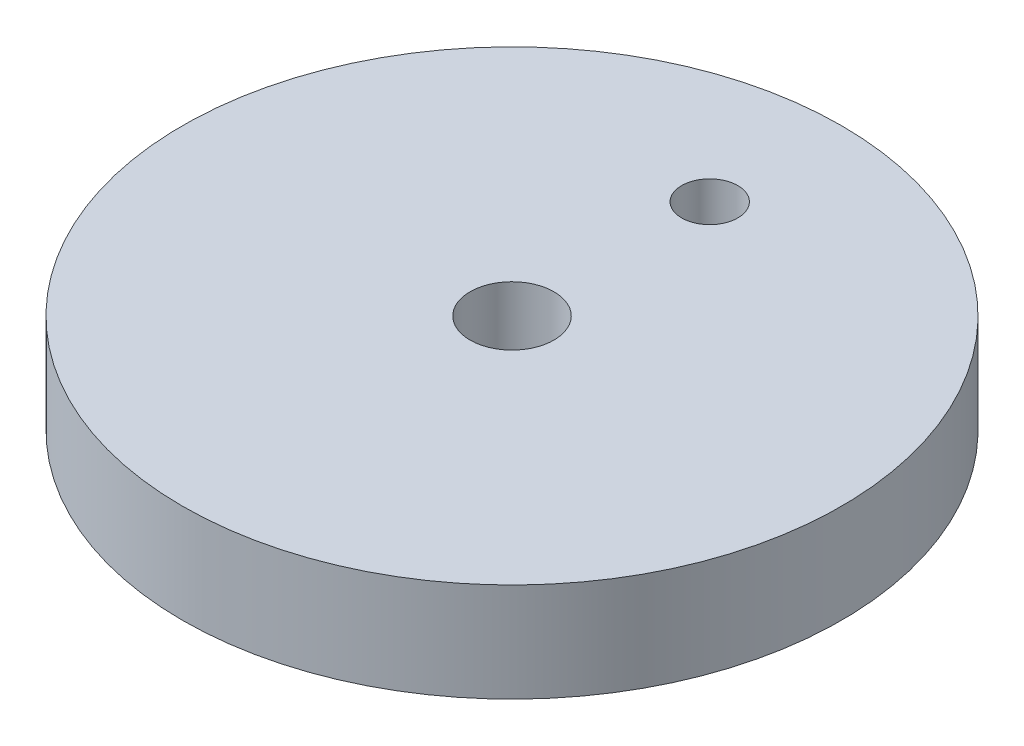
ISO-10303-21;
HEADER;
FILE_DESCRIPTION(('STEP AP214'),'2;1');
FILE_NAME('part.step','',(''),(''),'','','');
FILE_SCHEMA(('AUTOMOTIVE_DESIGN { 1 0 10303 214 1 1 1 1 }'));
ENDSEC;
DATA;
#1=APPLICATION_CONTEXT('core data for automotive mechanical design processes');
#2=APPLICATION_PROTOCOL_DEFINITION('international standard','automotive_design',2000,#1);
#3=PRODUCT_CONTEXT('',#1,'mechanical');
#4=PRODUCT('Part','Part','',(#3));
#5=PRODUCT_RELATED_PRODUCT_CATEGORY('part','',(#4));
#6=PRODUCT_DEFINITION_FORMATION('','',#4);
#7=PRODUCT_DEFINITION_CONTEXT('part definition',#1,'design');
#8=PRODUCT_DEFINITION('design','',#6,#7);
#9=PRODUCT_DEFINITION_SHAPE('','',#8);
#10=(LENGTH_UNIT() NAMED_UNIT(*) SI_UNIT(.MILLI.,.METRE.));
#11=(NAMED_UNIT(*) PLANE_ANGLE_UNIT() SI_UNIT($,.RADIAN.));
#12=(NAMED_UNIT(*) SI_UNIT($,.STERADIAN.) SOLID_ANGLE_UNIT());
#13=UNCERTAINTY_MEASURE_WITH_UNIT(LENGTH_MEASURE(1.E-05),#10,'distance_accuracy_value','');
#14=(GEOMETRIC_REPRESENTATION_CONTEXT(3) GLOBAL_UNCERTAINTY_ASSIGNED_CONTEXT((#13)) GLOBAL_UNIT_ASSIGNED_CONTEXT((#10,
#11,#12)) REPRESENTATION_CONTEXT('',''));
#15=CARTESIAN_POINT('',(0.,0.,0.));
#16=DIRECTION('',(0.,0.,1.));
#17=DIRECTION('',(1.,0.,0.));
#18=AXIS2_PLACEMENT_3D('',#15,#16,#17);
#19=CARTESIAN_POINT('',(0.,4.7625,0.));
#20=DIRECTION('',(0.,-1.,0.));
#21=DIRECTION('',(0.,0.,-1.));
#22=AXIS2_PLACEMENT_3D('',#19,#20,#21);
#23=CYLINDRICAL_SURFACE('',#22,15.875);
#24=CARTESIAN_POINT('',(0.,4.7625,0.));
#25=DIRECTION('',(0.,1.,0.));
#26=DIRECTION('',(0.,0.,1.));
#27=AXIS2_PLACEMENT_3D('',#24,#25,#26);
#28=CIRCLE('',#27,15.875);
#29=CARTESIAN_POINT('',(0.,4.7625,-15.875));
#30=VERTEX_POINT('',#29);
#31=EDGE_CURVE('E12',#30,#30,#28,.T.);
#32=CARTESIAN_POINT('',(0.,0.,0.));
#33=DIRECTION('',(0.,1.,0.));
#34=DIRECTION('',(0.,0.,1.));
#35=AXIS2_PLACEMENT_3D('',#32,#33,#34);
#36=CIRCLE('',#35,15.875);
#37=CARTESIAN_POINT('',(0.,0.,-15.875));
#38=VERTEX_POINT('',#37);
#39=EDGE_CURVE('E47',#38,#38,#36,.T.);
#40=CARTESIAN_POINT('',(0.,4.7625,-15.875));
#41=CARTESIAN_POINT('',(0.,4.712890625,-15.875));
#42=CARTESIAN_POINT('',(0.,4.66328125,-15.875));
#43=CARTESIAN_POINT('',(0.,4.5640625,-15.875));
#44=CARTESIAN_POINT('',(0.,4.514453125,-15.875));
#45=CARTESIAN_POINT('',(0.,4.415234375,-15.875));
#46=CARTESIAN_POINT('',(0.,4.365625,-15.875));
#47=CARTESIAN_POINT('',(0.,4.26640625,-15.875));
#48=CARTESIAN_POINT('',(0.,4.216796875,-15.875));
#49=CARTESIAN_POINT('',(0.,4.117578125,-15.875));
#50=CARTESIAN_POINT('',(0.,4.06796875,-15.875));
#51=CARTESIAN_POINT('',(0.,3.96875,-15.875));
#52=CARTESIAN_POINT('',(0.,3.919140625,-15.875));
#53=CARTESIAN_POINT('',(0.,3.819921875,-15.875));
#54=CARTESIAN_POINT('',(0.,3.7703125,-15.875));
#55=CARTESIAN_POINT('',(0.,3.67109375,-15.875));
#56=CARTESIAN_POINT('',(0.,3.621484375,-15.875));
#57=CARTESIAN_POINT('',(0.,3.522265625,-15.875));
#58=CARTESIAN_POINT('',(0.,3.47265625,-15.875));
#59=CARTESIAN_POINT('',(0.,3.3734375,-15.875));
#60=CARTESIAN_POINT('',(0.,3.323828125,-15.875));
#61=CARTESIAN_POINT('',(0.,3.224609375,-15.875));
#62=CARTESIAN_POINT('',(0.,3.175,-15.875));
#63=CARTESIAN_POINT('',(0.,3.07578125,-15.875));
#64=CARTESIAN_POINT('',(0.,3.026171875,-15.875));
#65=CARTESIAN_POINT('',(0.,2.926953125,-15.875));
#66=CARTESIAN_POINT('',(0.,2.87734375,-15.875));
#67=CARTESIAN_POINT('',(0.,2.778125,-15.875));
#68=CARTESIAN_POINT('',(0.,2.728515625,-15.875));
#69=CARTESIAN_POINT('',(0.,2.629296875,-15.875));
#70=CARTESIAN_POINT('',(0.,2.5796875,-15.875));
#71=CARTESIAN_POINT('',(0.,2.48046875,-15.875));
#72=CARTESIAN_POINT('',(0.,2.430859375,-15.875));
#73=CARTESIAN_POINT('',(0.,2.331640625,-15.875));
#74=CARTESIAN_POINT('',(0.,2.28203125,-15.875));
#75=CARTESIAN_POINT('',(0.,2.1828125,-15.875));
#76=CARTESIAN_POINT('',(0.,2.133203125,-15.875));
#77=CARTESIAN_POINT('',(0.,2.033984375,-15.875));
#78=CARTESIAN_POINT('',(0.,1.984375,-15.875));
#79=CARTESIAN_POINT('',(0.,1.88515625,-15.875));
#80=CARTESIAN_POINT('',(0.,1.835546875,-15.875));
#81=CARTESIAN_POINT('',(0.,1.736328125,-15.875));
#82=CARTESIAN_POINT('',(0.,1.68671875,-15.875));
#83=CARTESIAN_POINT('',(0.,1.5875,-15.875));
#84=CARTESIAN_POINT('',(0.,1.537890625,-15.875));
#85=CARTESIAN_POINT('',(0.,1.438671875,-15.875));
#86=CARTESIAN_POINT('',(0.,1.3890625,-15.875));
#87=CARTESIAN_POINT('',(0.,1.28984375,-15.875));
#88=CARTESIAN_POINT('',(0.,1.240234375,-15.875));
#89=CARTESIAN_POINT('',(0.,1.141015625,-15.875));
#90=CARTESIAN_POINT('',(0.,1.09140625,-15.875));
#91=CARTESIAN_POINT('',(0.,0.992187499999999,-15.875));
#92=CARTESIAN_POINT('',(0.,0.942578124999999,-15.875));
#93=CARTESIAN_POINT('',(0.,0.843359375,-15.875));
#94=CARTESIAN_POINT('',(0.,0.79375,-15.875));
#95=CARTESIAN_POINT('',(0.,0.69453125,-15.875));
#96=CARTESIAN_POINT('',(0.,0.644921875,-15.875));
#97=CARTESIAN_POINT('',(0.,0.545703125,-15.875));
#98=CARTESIAN_POINT('',(0.,0.49609375,-15.875));
#99=CARTESIAN_POINT('',(0.,0.396875,-15.875));
#100=CARTESIAN_POINT('',(0.,0.347265625,-15.875));
#101=CARTESIAN_POINT('',(0.,0.248046875,-15.875));
#102=CARTESIAN_POINT('',(0.,0.1984375,-15.875));
#103=CARTESIAN_POINT('',(0.,0.09921875,-15.875));
#104=CARTESIAN_POINT('',(0.,0.049609375,-15.875));
#105=CARTESIAN_POINT('',(0.,0.,-15.875));
#106=B_SPLINE_CURVE_WITH_KNOTS('',3,(#40,#41,#42,#43,#44,#45,#46,#47,#48,#49,#50,#51,#52,#53,
#54,#55,#56,#57,#58,#59,#60,#61,#62,#63,#64,#65,#66,#67,#68,#69,#70,#71,#72,#73,#74,#75,#76,#77,
#78,#79,#80,#81,#82,#83,#84,#85,#86,#87,#88,#89,#90,#91,#92,#93,#94,#95,#96,#97,#98,#99,#100,
#101,#102,#103,#104,#105),.UNSPECIFIED.,.F.,.F.,(4,2,2,2,2,2,2,2,2,2,2,2,2,2,2,2,2,2,2,2,2,2,2,
2,2,2,2,2,2,2,2,2,4),(0.,0.148828125,0.29765625,0.446484375,0.5953125,0.744140625,
0.892968750000001,1.041796875,1.190625,1.339453125,1.48828125,1.637109375,1.7859375,1.934765625,
2.08359375,2.232421875,2.38125,2.530078125,2.67890625,2.827734375,2.9765625,3.125390625,
3.27421875,3.423046875,3.571875,3.720703125,3.86953125,4.018359375,4.1671875,4.316015625,
4.46484375,4.613671875,4.7625),.UNSPECIFIED.);
#107=EDGE_CURVE('BSEAM44',#30,#38,#106,.T.);
#108=ORIENTED_EDGE('',*,*,#31,.F.);
#109=ORIENTED_EDGE('',*,*,#39,.T.);
#110=ORIENTED_EDGE('',*,*,#107,.T.);
#111=ORIENTED_EDGE('',*,*,#107,.F.);
#112=EDGE_LOOP('',(#108,#110,#109,#111));
#113=FACE_BOUND('',#112,.T.);
#114=ADVANCED_FACE('F44',(#113),#23,.T.);
#115=CARTESIAN_POINT('',(0.,4.7625,0.));
#116=DIRECTION('',(0.,1.,0.));
#117=DIRECTION('',(0.,0.,1.));
#118=AXIS2_PLACEMENT_3D('',#115,#116,#117);
#119=PLANE('',#118);
#120=CARTESIAN_POINT('',(0.,4.7625,-9.525));
#121=DIRECTION('',(0.,1.,0.));
#122=DIRECTION('',(0.,0.,1.));
#123=AXIS2_PLACEMENT_3D('',#120,#121,#122);
#124=CIRCLE('',#123,1.35255);
#125=CARTESIAN_POINT('',(0.,4.7625,-8.17245));
#126=VERTEX_POINT('',#125);
#127=EDGE_CURVE('E64',#126,#126,#124,.T.);
#128=ORIENTED_EDGE('',*,*,#127,.F.);
#129=EDGE_LOOP('',(#128));
#130=FACE_BOUND('',#129,.T.);
#131=CARTESIAN_POINT('',(0.,4.7625,0.));
#132=DIRECTION('',(0.,1.,0.));
#133=DIRECTION('',(0.,0.,1.));
#134=AXIS2_PLACEMENT_3D('',#131,#132,#133);
#135=CIRCLE('',#134,2.01929999999999);
#136=CARTESIAN_POINT('',(0.,4.7625,2.01929999999999));
#137=VERTEX_POINT('',#136);
#138=EDGE_CURVE('E58',#137,#137,#135,.T.);
#139=ORIENTED_EDGE('',*,*,#138,.F.);
#140=EDGE_LOOP('',(#139));
#141=FACE_BOUND('',#140,.T.);
#142=ORIENTED_EDGE('',*,*,#31,.T.);
#143=EDGE_LOOP('',(#142));
#144=FACE_BOUND('',#143,.T.);
#145=ADVANCED_FACE('F70',(#130,#141,#144),#119,.T.);
#146=CARTESIAN_POINT('',(0.,0.,0.));
#147=DIRECTION('',(0.,1.,0.));
#148=DIRECTION('',(0.,0.,1.));
#149=AXIS2_PLACEMENT_3D('',#146,#147,#148);
#150=PLANE('',#149);
#151=CARTESIAN_POINT('',(0.,0.,-9.525));
#152=DIRECTION('',(0.,1.,0.));
#153=DIRECTION('',(0.,0.,1.));
#154=AXIS2_PLACEMENT_3D('',#151,#152,#153);
#155=CIRCLE('',#154,1.35255);
#156=CARTESIAN_POINT('',(0.,0.,-8.17245));
#157=VERTEX_POINT('',#156);
#158=EDGE_CURVE('E61',#157,#157,#155,.T.);
#159=ORIENTED_EDGE('',*,*,#158,.T.);
#160=EDGE_LOOP('',(#159));
#161=FACE_BOUND('',#160,.T.);
#162=CARTESIAN_POINT('',(0.,0.,0.));
#163=DIRECTION('',(0.,1.,0.));
#164=DIRECTION('',(0.,0.,1.));
#165=AXIS2_PLACEMENT_3D('',#162,#163,#164);
#166=CIRCLE('',#165,2.01929999999999);
#167=CARTESIAN_POINT('',(0.,0.,2.01929999999999));
#168=VERTEX_POINT('',#167);
#169=EDGE_CURVE('E54',#168,#168,#166,.T.);
#170=ORIENTED_EDGE('',*,*,#169,.T.);
#171=EDGE_LOOP('',(#170));
#172=FACE_BOUND('',#171,.T.);
#173=ORIENTED_EDGE('',*,*,#39,.F.);
#174=EDGE_LOOP('',(#173));
#175=FACE_BOUND('',#174,.T.);
#176=ADVANCED_FACE('F73',(#161,#172,#175),#150,.F.);
#177=CARTESIAN_POINT('',(0.,4.7625,0.));
#178=DIRECTION('',(0.,1.,0.));
#179=DIRECTION('',(0.,0.,1.));
#180=AXIS2_PLACEMENT_3D('',#177,#178,#179);
#181=CYLINDRICAL_SURFACE('',#180,2.01929999999999);
#182=ORIENTED_EDGE('',*,*,#169,.F.);
#183=EDGE_LOOP('',(#182));
#184=FACE_BOUND('',#183,.T.);
#185=ORIENTED_EDGE('',*,*,#138,.T.);
#186=EDGE_LOOP('',(#185));
#187=FACE_BOUND('',#186,.T.);
#188=ADVANCED_FACE('F77',(#184,#187),#181,.F.);
#189=CARTESIAN_POINT('',(0.,4.7625,-9.525));
#190=DIRECTION('',(0.,1.,0.));
#191=DIRECTION('',(0.,0.,1.));
#192=AXIS2_PLACEMENT_3D('',#189,#190,#191);
#193=CYLINDRICAL_SURFACE('',#192,1.35255);
#194=ORIENTED_EDGE('',*,*,#158,.F.);
#195=EDGE_LOOP('',(#194));
#196=FACE_BOUND('',#195,.T.);
#197=ORIENTED_EDGE('',*,*,#127,.T.);
#198=EDGE_LOOP('',(#197));
#199=FACE_BOUND('',#198,.T.);
#200=ADVANCED_FACE('F68',(#196,#199),#193,.F.);
#201=CLOSED_SHELL('',(#114,#145,#176,#188,#200));
#202=MANIFOLD_SOLID_BREP('B2',#201);
#203=ADVANCED_BREP_SHAPE_REPRESENTATION('',(#18,#202),#14);
#204=SHAPE_DEFINITION_REPRESENTATION(#9,#203);
ENDSEC;
END-ISO-10303-21;
